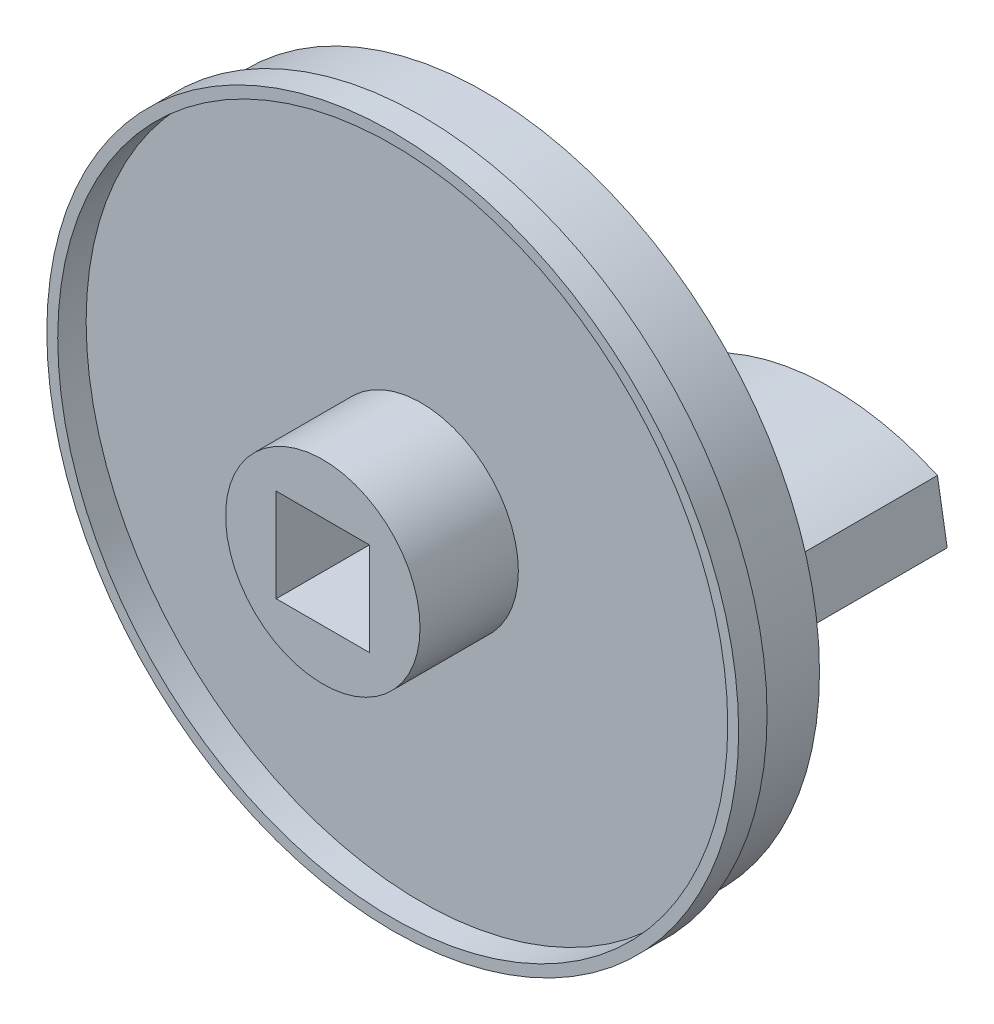
ISO-10303-21;
HEADER;
FILE_DESCRIPTION(('STEP AP214'),'2;1');
FILE_NAME('part.step','',(''),(''),'','','');
FILE_SCHEMA(('AUTOMOTIVE_DESIGN { 1 0 10303 214 1 1 1 1 }'));
ENDSEC;
DATA;
#1=APPLICATION_CONTEXT('core data for automotive mechanical design processes');
#2=APPLICATION_PROTOCOL_DEFINITION('international standard','automotive_design',2000,#1);
#3=PRODUCT_CONTEXT('',#1,'mechanical');
#4=PRODUCT('Part','Part','',(#3));
#5=PRODUCT_RELATED_PRODUCT_CATEGORY('part','',(#4));
#6=PRODUCT_DEFINITION_FORMATION('','',#4);
#7=PRODUCT_DEFINITION_CONTEXT('part definition',#1,'design');
#8=PRODUCT_DEFINITION('design','',#6,#7);
#9=PRODUCT_DEFINITION_SHAPE('','',#8);
#10=(LENGTH_UNIT() NAMED_UNIT(*) SI_UNIT(.MILLI.,.METRE.));
#11=(NAMED_UNIT(*) PLANE_ANGLE_UNIT() SI_UNIT($,.RADIAN.));
#12=(NAMED_UNIT(*) SI_UNIT($,.STERADIAN.) SOLID_ANGLE_UNIT());
#13=UNCERTAINTY_MEASURE_WITH_UNIT(LENGTH_MEASURE(1.E-05),#10,'distance_accuracy_value','');
#14=(GEOMETRIC_REPRESENTATION_CONTEXT(3) GLOBAL_UNCERTAINTY_ASSIGNED_CONTEXT((#13)) GLOBAL_UNIT_ASSIGNED_CONTEXT((#10,
#11,#12)) REPRESENTATION_CONTEXT('',''));
#15=CARTESIAN_POINT('',(0.,0.,0.));
#16=DIRECTION('',(0.,0.,1.));
#17=DIRECTION('',(1.,0.,0.));
#18=AXIS2_PLACEMENT_3D('',#15,#16,#17);
#19=CARTESIAN_POINT('',(0.,0.,-5.8166));
#20=DIRECTION('',(0.,0.,-1.));
#21=DIRECTION('',(-1.,0.,0.));
#22=AXIS2_PLACEMENT_3D('',#19,#20,#21);
#23=PLANE('',#22);
#24=CARTESIAN_POINT('',(6.89284040040389,-2.99914376690081,-5.8166));
#25=DIRECTION('',(0.,0.,-1.));
#26=DIRECTION('',(-1.,0.,0.));
#27=AXIS2_PLACEMENT_3D('',#24,#25,#26);
#28=CIRCLE('',#27,6.05951803560859);
#29=CARTESIAN_POINT('',(2.6465406178234,1.32366746889502,-5.8166));
#30=VERTEX_POINT('',#29);
#31=CARTESIAN_POINT('',(11.3117017932094,1.1471103033461,-5.8166));
#32=VERTEX_POINT('',#31);
#33=EDGE_CURVE('E65',#30,#32,#28,.T.);
#34=ORIENTED_EDGE('',*,*,#33,.F.);
#35=CARTESIAN_POINT('',(0.,0.,-5.8166));
#36=DIRECTION('',(0.,0.,-1.));
#37=DIRECTION('',(-1.,0.,0.));
#38=AXIS2_PLACEMENT_3D('',#35,#36,#37);
#39=CIRCLE('',#38,2.9591);
#40=CARTESIAN_POINT('',(1.95375325908428,2.22241333073251,-5.8166));
#41=VERTEX_POINT('',#40);
#42=EDGE_CURVE('E91',#41,#30,#39,.T.);
#43=ORIENTED_EDGE('',*,*,#42,.F.);
#44=CARTESIAN_POINT('',(7.268109870577,-5.01812678376207,-5.8166));
#45=DIRECTION('',(0.,0.,-1.));
#46=DIRECTION('',(-1.,0.,0.));
#47=AXIS2_PLACEMENT_3D('',#44,#45,#46);
#48=CIRCLE('',#47,8.98152589172471);
#49=CARTESIAN_POINT('',(10.9716639419307,3.16426251180931,-5.8166));
#50=VERTEX_POINT('',#49);
#51=EDGE_CURVE('E95',#41,#50,#48,.T.);
#52=ORIENTED_EDGE('',*,*,#51,.T.);
#53=DIRECTION('',(-0.16622792512151,0.986087357646267,0.));
#54=VECTOR('',#53,1.);
#55=CARTESIAN_POINT('',(11.1871688599829,1.88585712326514,-5.8166));
#56=LINE('',#55,#54);
#57=EDGE_CURVE('E98',#32,#50,#56,.T.);
#58=ORIENTED_EDGE('',*,*,#57,.F.);
#59=EDGE_LOOP('',(#34,#43,#52,#58));
#60=FACE_BOUND('',#59,.T.);
#61=ADVANCED_FACE('F57',(#60),#23,.T.);
#62=CARTESIAN_POINT('',(0.,0.,0.));
#63=DIRECTION('',(0.,0.,-1.));
#64=DIRECTION('',(-1.,0.,0.));
#65=AXIS2_PLACEMENT_3D('',#62,#63,#64);
#66=PLANE('',#65);
#67=CARTESIAN_POINT('',(6.89284040040389,-2.99914376690081,0.));
#68=DIRECTION('',(0.,0.,-1.));
#69=DIRECTION('',(-1.,0.,0.));
#70=AXIS2_PLACEMENT_3D('',#67,#68,#69);
#71=CIRCLE('',#70,6.05951803560859);
#72=CARTESIAN_POINT('',(2.6465406178234,1.32366746889502,0.));
#73=VERTEX_POINT('',#72);
#74=CARTESIAN_POINT('',(11.3117017932094,1.1471103033461,0.));
#75=VERTEX_POINT('',#74);
#76=EDGE_CURVE('E114',#73,#75,#71,.T.);
#77=ORIENTED_EDGE('',*,*,#76,.T.);
#78=DIRECTION('',(-0.16622792512151,0.986087357646268,0.));
#79=VECTOR('',#78,1.);
#80=CARTESIAN_POINT('',(11.1871688599829,1.88585712326514,0.));
#81=LINE('',#80,#79);
#82=CARTESIAN_POINT('',(10.9716639419307,3.16426251180931,0.));
#83=VERTEX_POINT('',#82);
#84=EDGE_CURVE('E110',#75,#83,#81,.T.);
#85=ORIENTED_EDGE('',*,*,#84,.T.);
#86=CARTESIAN_POINT('',(7.268109870577,-5.01812678376207,0.));
#87=DIRECTION('',(0.,0.,-1.));
#88=DIRECTION('',(-1.,0.,0.));
#89=AXIS2_PLACEMENT_3D('',#86,#87,#88);
#90=CIRCLE('',#89,8.98152589172471);
#91=CARTESIAN_POINT('',(1.95375325908428,2.22241333073251,0.));
#92=VERTEX_POINT('',#91);
#93=EDGE_CURVE('E120',#92,#83,#90,.T.);
#94=ORIENTED_EDGE('',*,*,#93,.F.);
#95=CARTESIAN_POINT('',(0.,0.,0.));
#96=DIRECTION('',(0.,0.,-1.));
#97=DIRECTION('',(-1.,0.,0.));
#98=AXIS2_PLACEMENT_3D('',#95,#96,#97);
#99=CIRCLE('',#98,2.9591);
#100=EDGE_CURVE('E102',#92,#73,#99,.T.);
#101=ORIENTED_EDGE('',*,*,#100,.T.);
#102=EDGE_LOOP('',(#77,#85,#94,#101));
#103=FACE_BOUND('',#102,.T.);
#104=ADVANCED_FACE('F130',(#103),#66,.F.);
#105=CARTESIAN_POINT('',(11.1871688599829,1.88585712326514,-15.5891474364846));
#106=DIRECTION('',(0.986087357646267,0.16622792512151,0.));
#107=DIRECTION('',(-0.16622792512151,0.986087357646267,0.));
#108=AXIS2_PLACEMENT_3D('',#105,#106,#107);
#109=PLANE('',#108);
#110=DIRECTION('',(0.,0.,1.));
#111=VECTOR('',#110,1.);
#112=CARTESIAN_POINT('',(11.3117017932094,1.1471103033461,-15.5891474364846));
#113=LINE('',#112,#111);
#114=EDGE_CURVE('E13',#32,#75,#113,.T.);
#115=ORIENTED_EDGE('',*,*,#114,.F.);
#116=ORIENTED_EDGE('',*,*,#57,.T.);
#117=DIRECTION('',(0.,0.,1.));
#118=VECTOR('',#117,1.);
#119=CARTESIAN_POINT('',(10.9716639419307,3.16426251180931,-15.5891474364846));
#120=LINE('',#119,#118);
#121=EDGE_CURVE('E101',#50,#83,#120,.T.);
#122=ORIENTED_EDGE('',*,*,#121,.T.);
#123=ORIENTED_EDGE('',*,*,#84,.F.);
#124=EDGE_LOOP('',(#115,#116,#122,#123));
#125=FACE_BOUND('',#124,.T.);
#126=ADVANCED_FACE('F108',(#125),#109,.T.);
#127=CARTESIAN_POINT('',(7.268109870577,-5.01812678376207,-15.5891474364846));
#128=DIRECTION('',(0.,0.,1.));
#129=DIRECTION('',(1.,0.,0.));
#130=AXIS2_PLACEMENT_3D('',#127,#128,#129);
#131=CYLINDRICAL_SURFACE('',#130,8.98152589172471);
#132=ORIENTED_EDGE('',*,*,#51,.F.);
#133=DIRECTION('',(0.,0.,1.));
#134=VECTOR('',#133,1.);
#135=CARTESIAN_POINT('',(1.95375325908428,2.22241333073251,-15.5891474364846));
#136=LINE('',#135,#134);
#137=EDGE_CURVE('E121',#41,#92,#136,.T.);
#138=ORIENTED_EDGE('',*,*,#137,.T.);
#139=ORIENTED_EDGE('',*,*,#93,.T.);
#140=ORIENTED_EDGE('',*,*,#121,.F.);
#141=EDGE_LOOP('',(#132,#138,#139,#140));
#142=FACE_BOUND('',#141,.T.);
#143=ADVANCED_FACE('F127',(#142),#131,.T.);
#144=CARTESIAN_POINT('',(0.,0.,-15.5891474364846));
#145=DIRECTION('',(0.,0.,1.));
#146=DIRECTION('',(1.,0.,0.));
#147=AXIS2_PLACEMENT_3D('',#144,#145,#146);
#148=CYLINDRICAL_SURFACE('',#147,2.9591);
#149=ORIENTED_EDGE('',*,*,#137,.F.);
#150=ORIENTED_EDGE('',*,*,#42,.T.);
#151=DIRECTION('',(0.,0.,1.));
#152=VECTOR('',#151,1.);
#153=CARTESIAN_POINT('',(2.6465406178234,1.32366746889502,-15.5891474364846));
#154=LINE('',#153,#152);
#155=EDGE_CURVE('E105',#30,#73,#154,.T.);
#156=ORIENTED_EDGE('',*,*,#155,.T.);
#157=ORIENTED_EDGE('',*,*,#100,.F.);
#158=EDGE_LOOP('',(#149,#150,#156,#157));
#159=FACE_BOUND('',#158,.T.);
#160=ADVANCED_FACE('F131',(#159),#148,.F.);
#161=CARTESIAN_POINT('',(6.89284040040389,-2.99914376690081,-15.5891474364846));
#162=DIRECTION('',(0.,0.,1.));
#163=DIRECTION('',(1.,0.,0.));
#164=AXIS2_PLACEMENT_3D('',#161,#162,#163);
#165=CYLINDRICAL_SURFACE('',#164,6.05951803560859);
#166=ORIENTED_EDGE('',*,*,#155,.F.);
#167=ORIENTED_EDGE('',*,*,#33,.T.);
#168=ORIENTED_EDGE('',*,*,#114,.T.);
#169=ORIENTED_EDGE('',*,*,#76,.F.);
#170=EDGE_LOOP('',(#166,#167,#168,#169));
#171=FACE_BOUND('',#170,.T.);
#172=ADVANCED_FACE('F104',(#171),#165,.F.);
#173=CLOSED_SHELL('',(#61,#104,#126,#143,#160,#172));
#174=MANIFOLD_SOLID_BREP('B2',#173);
#175=CARTESIAN_POINT('',(0.,0.,-5.8166));
#176=DIRECTION('',(0.,0.,-1.));
#177=DIRECTION('',(-1.,0.,0.));
#178=AXIS2_PLACEMENT_3D('',#175,#176,#177);
#179=PLANE('',#178);
#180=CARTESIAN_POINT('',(-6.93978115667021,5.34283059569983,-5.8166));
#181=DIRECTION('',(0.,0.,-1.));
#182=DIRECTION('',(-1.,0.,0.));
#183=AXIS2_PLACEMENT_3D('',#180,#181,#182);
#184=CIRCLE('',#183,6.05951803560859);
#185=CARTESIAN_POINT('',(-2.8187839026646,0.900405530902014,-5.8166));
#186=VERTEX_POINT('',#185);
#187=CARTESIAN_POINT('',(-11.3117017932094,1.1471103033461,-5.8166));
#188=VERTEX_POINT('',#187);
#189=EDGE_CURVE('E226',#186,#188,#184,.T.);
#190=ORIENTED_EDGE('',*,*,#189,.F.);
#191=CARTESIAN_POINT('',(0.,0.,-5.8166));
#192=DIRECTION('',(0.,0.,-1.));
#193=DIRECTION('',(-1.,0.,0.));
#194=AXIS2_PLACEMENT_3D('',#191,#192,#193);
#195=CIRCLE('',#194,2.9591);
#196=CARTESIAN_POINT('',(-2.8187839026646,-0.900405530902013,-5.8166));
#197=VERTEX_POINT('',#196);
#198=EDGE_CURVE('E252',#197,#186,#195,.T.);
#199=ORIENTED_EDGE('',*,*,#198,.F.);
#200=CARTESIAN_POINT('',(-6.86282923836061,7.11916457394505,-5.8166));
#201=DIRECTION('',(0.,0.,-1.));
#202=DIRECTION('',(-1.,0.,0.));
#203=AXIS2_PLACEMENT_3D('',#200,#201,#202);
#204=CIRCLE('',#203,8.98152589172471);
#205=CARTESIAN_POINT('',(-10.9678064273725,-0.869387836937235,-5.8166));
#206=VERTEX_POINT('',#205);
#207=EDGE_CURVE('E256',#197,#206,#204,.T.);
#208=ORIENTED_EDGE('',*,*,#207,.T.);
#209=DIRECTION('',(0.16811367589518,-0.985767615605732,0.));
#210=VECTOR('',#209,1.);
#211=CARTESIAN_POINT('',(-10.8019078374516,-1.84216686010636,-5.8166));
#212=LINE('',#211,#210);
#213=EDGE_CURVE('E259',#188,#206,#212,.T.);
#214=ORIENTED_EDGE('',*,*,#213,.F.);
#215=EDGE_LOOP('',(#190,#199,#208,#214));
#216=FACE_BOUND('',#215,.T.);
#217=ADVANCED_FACE('F218',(#216),#179,.T.);
#218=CARTESIAN_POINT('',(0.,0.,0.));
#219=DIRECTION('',(0.,0.,-1.));
#220=DIRECTION('',(-1.,0.,0.));
#221=AXIS2_PLACEMENT_3D('',#218,#219,#220);
#222=PLANE('',#221);
#223=CARTESIAN_POINT('',(-6.93978115667021,5.34283059569983,0.));
#224=DIRECTION('',(0.,0.,-1.));
#225=DIRECTION('',(-1.,0.,0.));
#226=AXIS2_PLACEMENT_3D('',#223,#224,#225);
#227=CIRCLE('',#226,6.05951803560859);
#228=CARTESIAN_POINT('',(-2.8187839026646,0.900405530902014,0.));
#229=VERTEX_POINT('',#228);
#230=CARTESIAN_POINT('',(-11.3117017932094,1.1471103033461,0.));
#231=VERTEX_POINT('',#230);
#232=EDGE_CURVE('E275',#229,#231,#227,.T.);
#233=ORIENTED_EDGE('',*,*,#232,.T.);
#234=DIRECTION('',(0.16811367589518,-0.985767615605732,0.));
#235=VECTOR('',#234,1.);
#236=CARTESIAN_POINT('',(-10.8019078374516,-1.84216686010636,0.));
#237=LINE('',#236,#235);
#238=CARTESIAN_POINT('',(-10.9678064273725,-0.869387836937235,0.));
#239=VERTEX_POINT('',#238);
#240=EDGE_CURVE('E271',#231,#239,#237,.T.);
#241=ORIENTED_EDGE('',*,*,#240,.T.);
#242=CARTESIAN_POINT('',(-6.86282923836061,7.11916457394505,0.));
#243=DIRECTION('',(0.,0.,-1.));
#244=DIRECTION('',(-1.,0.,0.));
#245=AXIS2_PLACEMENT_3D('',#242,#243,#244);
#246=CIRCLE('',#245,8.98152589172471);
#247=CARTESIAN_POINT('',(-2.8187839026646,-0.900405530902012,0.));
#248=VERTEX_POINT('',#247);
#249=EDGE_CURVE('E281',#248,#239,#246,.T.);
#250=ORIENTED_EDGE('',*,*,#249,.F.);
#251=CARTESIAN_POINT('',(0.,0.,0.));
#252=DIRECTION('',(0.,0.,-1.));
#253=DIRECTION('',(-1.,0.,0.));
#254=AXIS2_PLACEMENT_3D('',#251,#252,#253);
#255=CIRCLE('',#254,2.9591);
#256=EDGE_CURVE('E263',#248,#229,#255,.T.);
#257=ORIENTED_EDGE('',*,*,#256,.T.);
#258=EDGE_LOOP('',(#233,#241,#250,#257));
#259=FACE_BOUND('',#258,.T.);
#260=ADVANCED_FACE('F291',(#259),#222,.F.);
#261=CARTESIAN_POINT('',(-10.8019078374516,-1.84216686010636,-15.5891474364846));
#262=DIRECTION('',(-0.985767615605732,-0.16811367589518,0.));
#263=DIRECTION('',(0.16811367589518,-0.985767615605732,0.));
#264=AXIS2_PLACEMENT_3D('',#261,#262,#263);
#265=PLANE('',#264);
#266=DIRECTION('',(0.,0.,1.));
#267=VECTOR('',#266,1.);
#268=CARTESIAN_POINT('',(-11.3117017932094,1.1471103033461,-15.5891474364846));
#269=LINE('',#268,#267);
#270=EDGE_CURVE('E55',#188,#231,#269,.T.);
#271=ORIENTED_EDGE('',*,*,#270,.F.);
#272=ORIENTED_EDGE('',*,*,#213,.T.);
#273=DIRECTION('',(0.,0.,1.));
#274=VECTOR('',#273,1.);
#275=CARTESIAN_POINT('',(-10.9678064273725,-0.869387836937235,-15.5891474364846));
#276=LINE('',#275,#274);
#277=EDGE_CURVE('E262',#206,#239,#276,.T.);
#278=ORIENTED_EDGE('',*,*,#277,.T.);
#279=ORIENTED_EDGE('',*,*,#240,.F.);
#280=EDGE_LOOP('',(#271,#272,#278,#279));
#281=FACE_BOUND('',#280,.T.);
#282=ADVANCED_FACE('F269',(#281),#265,.T.);
#283=CARTESIAN_POINT('',(-6.86282923836061,7.11916457394505,-15.5891474364846));
#284=DIRECTION('',(0.,0.,1.));
#285=DIRECTION('',(1.,0.,0.));
#286=AXIS2_PLACEMENT_3D('',#283,#284,#285);
#287=CYLINDRICAL_SURFACE('',#286,8.98152589172471);
#288=ORIENTED_EDGE('',*,*,#207,.F.);
#289=DIRECTION('',(0.,0.,1.));
#290=VECTOR('',#289,1.);
#291=CARTESIAN_POINT('',(-2.8187839026646,-0.900405530902012,-15.5891474364846));
#292=LINE('',#291,#290);
#293=EDGE_CURVE('E282',#197,#248,#292,.T.);
#294=ORIENTED_EDGE('',*,*,#293,.T.);
#295=ORIENTED_EDGE('',*,*,#249,.T.);
#296=ORIENTED_EDGE('',*,*,#277,.F.);
#297=EDGE_LOOP('',(#288,#294,#295,#296));
#298=FACE_BOUND('',#297,.T.);
#299=ADVANCED_FACE('F288',(#298),#287,.T.);
#300=CARTESIAN_POINT('',(0.,0.,-15.5891474364846));
#301=DIRECTION('',(0.,0.,1.));
#302=DIRECTION('',(1.,0.,0.));
#303=AXIS2_PLACEMENT_3D('',#300,#301,#302);
#304=CYLINDRICAL_SURFACE('',#303,2.9591);
#305=ORIENTED_EDGE('',*,*,#293,.F.);
#306=ORIENTED_EDGE('',*,*,#198,.T.);
#307=DIRECTION('',(0.,0.,1.));
#308=VECTOR('',#307,1.);
#309=CARTESIAN_POINT('',(-2.8187839026646,0.900405530902014,-15.5891474364846));
#310=LINE('',#309,#308);
#311=EDGE_CURVE('E266',#186,#229,#310,.T.);
#312=ORIENTED_EDGE('',*,*,#311,.T.);
#313=ORIENTED_EDGE('',*,*,#256,.F.);
#314=EDGE_LOOP('',(#305,#306,#312,#313));
#315=FACE_BOUND('',#314,.T.);
#316=ADVANCED_FACE('F292',(#315),#304,.F.);
#317=CARTESIAN_POINT('',(-6.93978115667021,5.34283059569983,-15.5891474364846));
#318=DIRECTION('',(0.,0.,1.));
#319=DIRECTION('',(1.,0.,0.));
#320=AXIS2_PLACEMENT_3D('',#317,#318,#319);
#321=CYLINDRICAL_SURFACE('',#320,6.05951803560859);
#322=ORIENTED_EDGE('',*,*,#311,.F.);
#323=ORIENTED_EDGE('',*,*,#189,.T.);
#324=ORIENTED_EDGE('',*,*,#270,.T.);
#325=ORIENTED_EDGE('',*,*,#232,.F.);
#326=EDGE_LOOP('',(#322,#323,#324,#325));
#327=FACE_BOUND('',#326,.T.);
#328=ADVANCED_FACE('F265',(#327),#321,.F.);
#329=CLOSED_SHELL('',(#217,#260,#282,#299,#316,#328));
#330=MANIFOLD_SOLID_BREP('B7',#329);
#331=CARTESIAN_POINT('',(0.,0.,2.2098));
#332=DIRECTION('',(0.,0.,1.));
#333=DIRECTION('',(1.,0.,0.));
#334=AXIS2_PLACEMENT_3D('',#331,#332,#333);
#335=PLANE('',#334);
#336=CARTESIAN_POINT('',(0.,0.,2.2098));
#337=DIRECTION('',(0.,0.,1.));
#338=DIRECTION('',(1.,0.,0.));
#339=AXIS2_PLACEMENT_3D('',#336,#337,#338);
#340=CIRCLE('',#339,12.065);
#341=CARTESIAN_POINT('',(12.065,0.,2.2098));
#342=VERTEX_POINT('',#341);
#343=EDGE_CURVE('E217',#342,#342,#340,.T.);
#344=ORIENTED_EDGE('',*,*,#343,.T.);
#345=EDGE_LOOP('',(#344));
#346=FACE_BOUND('',#345,.T.);
#347=CARTESIAN_POINT('',(0.,0.,2.2098));
#348=DIRECTION('',(0.,0.,1.));
#349=DIRECTION('',(1.,0.,0.));
#350=AXIS2_PLACEMENT_3D('',#347,#348,#349);
#351=CIRCLE('',#350,11.684);
#352=CARTESIAN_POINT('',(11.684,0.,2.2098));
#353=VERTEX_POINT('',#352);
#354=EDGE_CURVE('E391',#353,#353,#351,.T.);
#355=ORIENTED_EDGE('',*,*,#354,.F.);
#356=EDGE_LOOP('',(#355));
#357=FACE_BOUND('',#356,.T.);
#358=ADVANCED_FACE('F380',(#346,#357),#335,.T.);
#359=CARTESIAN_POINT('',(0.,0.,1.2192));
#360=DIRECTION('',(0.,0.,1.));
#361=DIRECTION('',(1.,0.,0.));
#362=AXIS2_PLACEMENT_3D('',#359,#360,#361);
#363=PLANE('',#362);
#364=CARTESIAN_POINT('',(0.,0.,1.2192));
#365=DIRECTION('',(0.,0.,1.));
#366=DIRECTION('',(1.,0.,0.));
#367=AXIS2_PLACEMENT_3D('',#364,#365,#366);
#368=CIRCLE('',#367,12.065);
#369=CARTESIAN_POINT('',(12.065,0.,1.2192));
#370=VERTEX_POINT('',#369);
#371=EDGE_CURVE('E384',#370,#370,#368,.T.);
#372=ORIENTED_EDGE('',*,*,#371,.F.);
#373=EDGE_LOOP('',(#372));
#374=FACE_BOUND('',#373,.T.);
#375=CARTESIAN_POINT('',(0.,0.,1.2192));
#376=DIRECTION('',(0.,0.,1.));
#377=DIRECTION('',(1.,0.,0.));
#378=AXIS2_PLACEMENT_3D('',#375,#376,#377);
#379=CIRCLE('',#378,11.684);
#380=CARTESIAN_POINT('',(11.684,0.,1.2192));
#381=VERTEX_POINT('',#380);
#382=EDGE_CURVE('E393',#381,#381,#379,.T.);
#383=ORIENTED_EDGE('',*,*,#382,.T.);
#384=EDGE_LOOP('',(#383));
#385=FACE_BOUND('',#384,.T.);
#386=ADVANCED_FACE('F403',(#374,#385),#363,.F.);
#387=CARTESIAN_POINT('',(0.,0.,2.2098));
#388=DIRECTION('',(0.,0.,-1.));
#389=DIRECTION('',(-1.,0.,0.));
#390=AXIS2_PLACEMENT_3D('',#387,#388,#389);
#391=CYLINDRICAL_SURFACE('',#390,12.065);
#392=ORIENTED_EDGE('',*,*,#343,.F.);
#393=EDGE_LOOP('',(#392));
#394=FACE_BOUND('',#393,.T.);
#395=ORIENTED_EDGE('',*,*,#371,.T.);
#396=EDGE_LOOP('',(#395));
#397=FACE_BOUND('',#396,.T.);
#398=ADVANCED_FACE('F382',(#394,#397),#391,.T.);
#399=CARTESIAN_POINT('',(0.,0.,2.2098));
#400=DIRECTION('',(0.,0.,-1.));
#401=DIRECTION('',(-1.,0.,0.));
#402=AXIS2_PLACEMENT_3D('',#399,#400,#401);
#403=CYLINDRICAL_SURFACE('',#402,11.684);
#404=ORIENTED_EDGE('',*,*,#354,.T.);
#405=EDGE_LOOP('',(#404));
#406=FACE_BOUND('',#405,.T.);
#407=ORIENTED_EDGE('',*,*,#382,.F.);
#408=EDGE_LOOP('',(#407));
#409=FACE_BOUND('',#408,.T.);
#410=ADVANCED_FACE('F399',(#406,#409),#403,.F.);
#411=CLOSED_SHELL('',(#358,#386,#398,#410));
#412=MANIFOLD_SOLID_BREP('B49',#411);
#413=CARTESIAN_POINT('',(0.,0.,1.2192));
#414=DIRECTION('',(0.,0.,1.));
#415=DIRECTION('',(1.,0.,0.));
#416=AXIS2_PLACEMENT_3D('',#413,#414,#415);
#417=PLANE('',#416);
#418=CARTESIAN_POINT('',(0.,0.,1.2192));
#419=DIRECTION('',(0.,0.,1.));
#420=DIRECTION('',(1.,0.,0.));
#421=AXIS2_PLACEMENT_3D('',#418,#419,#420);
#422=CIRCLE('',#421,11.684);
#423=CARTESIAN_POINT('',(11.684,0.,1.2192));
#424=VERTEX_POINT('',#423);
#425=EDGE_CURVE('E540',#424,#424,#422,.T.);
#426=ORIENTED_EDGE('',*,*,#425,.T.);
#427=EDGE_LOOP('',(#426));
#428=FACE_BOUND('',#427,.T.);
#429=CARTESIAN_POINT('',(0.,0.,1.2192));
#430=DIRECTION('',(0.,0.,1.));
#431=DIRECTION('',(1.,0.,0.));
#432=AXIS2_PLACEMENT_3D('',#429,#430,#431);
#433=CIRCLE('',#432,3.3909);
#434=CARTESIAN_POINT('',(3.3909,0.,1.2192));
#435=VERTEX_POINT('',#434);
#436=EDGE_CURVE('E513',#435,#435,#433,.T.);
#437=ORIENTED_EDGE('',*,*,#436,.F.);
#438=EDGE_LOOP('',(#437));
#439=FACE_BOUND('',#438,.T.);
#440=ADVANCED_FACE('F457',(#428,#439),#417,.T.);
#441=CARTESIAN_POINT('',(0.,0.,1.2192));
#442=DIRECTION('',(0.,0.,-1.));
#443=DIRECTION('',(-1.,0.,0.));
#444=AXIS2_PLACEMENT_3D('',#441,#442,#443);
#445=CYLINDRICAL_SURFACE('',#444,11.684);
#446=ORIENTED_EDGE('',*,*,#425,.F.);
#447=EDGE_LOOP('',(#446));
#448=FACE_BOUND('',#447,.T.);
#449=CARTESIAN_POINT('',(0.,0.,-0.9906));
#450=DIRECTION('',(0.,0.,-1.));
#451=DIRECTION('',(-1.,0.,0.));
#452=AXIS2_PLACEMENT_3D('',#449,#450,#451);
#453=CIRCLE('',#452,11.684);
#454=CARTESIAN_POINT('',(-11.684,0.,-0.9906));
#455=VERTEX_POINT('',#454);
#456=EDGE_CURVE('E527',#455,#455,#453,.T.);
#457=ORIENTED_EDGE('',*,*,#456,.F.);
#458=EDGE_LOOP('',(#457));
#459=FACE_BOUND('',#458,.T.);
#460=ADVANCED_FACE('F459',(#448,#459),#445,.T.);
#461=CARTESIAN_POINT('',(0.,0.,4.6482));
#462=DIRECTION('',(0.,0.,1.));
#463=DIRECTION('',(1.,0.,0.));
#464=AXIS2_PLACEMENT_3D('',#461,#462,#463);
#465=PLANE('',#464);
#466=CARTESIAN_POINT('',(0.,0.,4.6482));
#467=DIRECTION('',(0.,0.,1.));
#468=DIRECTION('',(1.,0.,0.));
#469=AXIS2_PLACEMENT_3D('',#466,#467,#468);
#470=CIRCLE('',#469,3.3909);
#471=CARTESIAN_POINT('',(3.3909,0.,4.6482));
#472=VERTEX_POINT('',#471);
#473=EDGE_CURVE('E537',#472,#472,#470,.T.);
#474=ORIENTED_EDGE('',*,*,#473,.T.);
#475=EDGE_LOOP('',(#474));
#476=FACE_BOUND('',#475,.T.);
#477=DIRECTION('',(-1.,0.,0.));
#478=VECTOR('',#477,1.);
#479=CARTESIAN_POINT('',(-1.6256,1.6256,4.6482));
#480=LINE('',#479,#478);
#481=CARTESIAN_POINT('',(1.6256,1.6256,4.6482));
#482=VERTEX_POINT('',#481);
#483=CARTESIAN_POINT('',(-1.6256,1.6256,4.6482));
#484=VERTEX_POINT('',#483);
#485=EDGE_CURVE('E507',#482,#484,#480,.T.);
#486=ORIENTED_EDGE('',*,*,#485,.F.);
#487=DIRECTION('',(0.,1.,0.));
#488=VECTOR('',#487,1.);
#489=CARTESIAN_POINT('',(1.6256,-1.6256,4.6482));
#490=LINE('',#489,#488);
#491=CARTESIAN_POINT('',(1.6256,-1.6256,4.6482));
#492=VERTEX_POINT('',#491);
#493=EDGE_CURVE('E498',#492,#482,#490,.T.);
#494=ORIENTED_EDGE('',*,*,#493,.F.);
#495=DIRECTION('',(1.,0.,0.));
#496=VECTOR('',#495,1.);
#497=CARTESIAN_POINT('',(-1.6256,-1.6256,4.6482));
#498=LINE('',#497,#496);
#499=CARTESIAN_POINT('',(-1.6256,-1.6256,4.6482));
#500=VERTEX_POINT('',#499);
#501=EDGE_CURVE('E521',#500,#492,#498,.T.);
#502=ORIENTED_EDGE('',*,*,#501,.F.);
#503=DIRECTION('',(0.,-1.,0.));
#504=VECTOR('',#503,1.);
#505=CARTESIAN_POINT('',(-1.6256,-1.6256,4.6482));
#506=LINE('',#505,#504);
#507=EDGE_CURVE('E519',#484,#500,#506,.T.);
#508=ORIENTED_EDGE('',*,*,#507,.F.);
#509=EDGE_LOOP('',(#486,#494,#502,#508));
#510=FACE_BOUND('',#509,.T.);
#511=ADVANCED_FACE('F517',(#476,#510),#465,.T.);
#512=CARTESIAN_POINT('',(0.,0.,4.6482));
#513=DIRECTION('',(0.,0.,-1.));
#514=DIRECTION('',(-1.,0.,0.));
#515=AXIS2_PLACEMENT_3D('',#512,#513,#514);
#516=CYLINDRICAL_SURFACE('',#515,3.3909);
#517=ORIENTED_EDGE('',*,*,#473,.F.);
#518=EDGE_LOOP('',(#517));
#519=FACE_BOUND('',#518,.T.);
#520=ORIENTED_EDGE('',*,*,#436,.T.);
#521=EDGE_LOOP('',(#520));
#522=FACE_BOUND('',#521,.T.);
#523=ADVANCED_FACE('F622',(#519,#522),#516,.T.);
#524=CARTESIAN_POINT('',(1.6256,-1.6256,4.6482));
#525=DIRECTION('',(-1.,0.,0.));
#526=DIRECTION('',(0.,0.,1.));
#527=AXIS2_PLACEMENT_3D('',#524,#525,#526);
#528=PLANE('',#527);
#529=DIRECTION('',(0.,1.,0.));
#530=VECTOR('',#529,1.);
#531=CARTESIAN_POINT('',(1.6256,-1.6256,1.2192));
#532=LINE('',#531,#530);
#533=CARTESIAN_POINT('',(1.6256,-1.6256,1.2192));
#534=VERTEX_POINT('',#533);
#535=CARTESIAN_POINT('',(1.6256,1.6256,1.2192));
#536=VERTEX_POINT('',#535);
#537=EDGE_CURVE('E473',#534,#536,#532,.T.);
#538=ORIENTED_EDGE('',*,*,#537,.F.);
#539=DIRECTION('',(0.,0.,-1.));
#540=VECTOR('',#539,1.);
#541=CARTESIAN_POINT('',(1.6256,-1.6256,4.6482));
#542=LINE('',#541,#540);
#543=EDGE_CURVE('E503',#492,#534,#542,.T.);
#544=ORIENTED_EDGE('',*,*,#543,.F.);
#545=ORIENTED_EDGE('',*,*,#493,.T.);
#546=DIRECTION('',(0.,0.,-1.));
#547=VECTOR('',#546,1.);
#548=CARTESIAN_POINT('',(1.6256,1.6256,4.6482));
#549=LINE('',#548,#547);
#550=EDGE_CURVE('E501',#482,#536,#549,.T.);
#551=ORIENTED_EDGE('',*,*,#550,.T.);
#552=EDGE_LOOP('',(#538,#544,#545,#551));
#553=FACE_BOUND('',#552,.T.);
#554=ADVANCED_FACE('F500',(#553),#528,.T.);
#555=CARTESIAN_POINT('',(-1.6256,1.6256,4.6482));
#556=DIRECTION('',(0.,-1.,0.));
#557=DIRECTION('',(0.,0.,-1.));
#558=AXIS2_PLACEMENT_3D('',#555,#556,#557);
#559=PLANE('',#558);
#560=DIRECTION('',(-1.,0.,0.));
#561=VECTOR('',#560,1.);
#562=CARTESIAN_POINT('',(-1.6256,1.6256,1.2192));
#563=LINE('',#562,#561);
#564=CARTESIAN_POINT('',(-1.6256,1.6256,1.2192));
#565=VERTEX_POINT('',#564);
#566=EDGE_CURVE('E477',#536,#565,#563,.T.);
#567=ORIENTED_EDGE('',*,*,#566,.F.);
#568=ORIENTED_EDGE('',*,*,#550,.F.);
#569=ORIENTED_EDGE('',*,*,#485,.T.);
#570=DIRECTION('',(0.,0.,-1.));
#571=VECTOR('',#570,1.);
#572=CARTESIAN_POINT('',(-1.6256,1.6256,4.6482));
#573=LINE('',#572,#571);
#574=EDGE_CURVE('E514',#484,#565,#573,.T.);
#575=ORIENTED_EDGE('',*,*,#574,.T.);
#576=EDGE_LOOP('',(#567,#568,#569,#575));
#577=FACE_BOUND('',#576,.T.);
#578=ADVANCED_FACE('F511',(#577),#559,.T.);
#579=CARTESIAN_POINT('',(-1.6256,-1.6256,4.6482));
#580=DIRECTION('',(1.,0.,0.));
#581=DIRECTION('',(0.,0.,-1.));
#582=AXIS2_PLACEMENT_3D('',#579,#580,#581);
#583=PLANE('',#582);
#584=DIRECTION('',(0.,-1.,0.));
#585=VECTOR('',#584,1.);
#586=CARTESIAN_POINT('',(-1.6256,-1.6256,1.2192));
#587=LINE('',#586,#585);
#588=CARTESIAN_POINT('',(-1.6256,-1.6256,1.2192));
#589=VERTEX_POINT('',#588);
#590=EDGE_CURVE('E529',#565,#589,#587,.T.);
#591=ORIENTED_EDGE('',*,*,#590,.F.);
#592=ORIENTED_EDGE('',*,*,#574,.F.);
#593=ORIENTED_EDGE('',*,*,#507,.T.);
#594=DIRECTION('',(0.,0.,-1.));
#595=VECTOR('',#594,1.);
#596=CARTESIAN_POINT('',(-1.6256,-1.6256,4.6482));
#597=LINE('',#596,#595);
#598=EDGE_CURVE('E533',#500,#589,#597,.T.);
#599=ORIENTED_EDGE('',*,*,#598,.T.);
#600=EDGE_LOOP('',(#591,#592,#593,#599));
#601=FACE_BOUND('',#600,.T.);
#602=ADVANCED_FACE('F608',(#601),#583,.T.);
#603=CARTESIAN_POINT('',(-1.6256,-1.6256,4.6482));
#604=DIRECTION('',(0.,1.,0.));
#605=DIRECTION('',(0.,0.,1.));
#606=AXIS2_PLACEMENT_3D('',#603,#604,#605);
#607=PLANE('',#606);
#608=DIRECTION('',(1.,0.,0.));
#609=VECTOR('',#608,1.);
#610=CARTESIAN_POINT('',(-1.6256,-1.6256,1.2192));
#611=LINE('',#610,#609);
#612=EDGE_CURVE('E508',#589,#534,#611,.T.);
#613=ORIENTED_EDGE('',*,*,#612,.F.);
#614=ORIENTED_EDGE('',*,*,#598,.F.);
#615=ORIENTED_EDGE('',*,*,#501,.T.);
#616=ORIENTED_EDGE('',*,*,#543,.T.);
#617=EDGE_LOOP('',(#613,#614,#615,#616));
#618=FACE_BOUND('',#617,.T.);
#619=ADVANCED_FACE('F601',(#618),#607,.T.);
#620=ORIENTED_EDGE('',*,*,#537,.T.);
#621=ORIENTED_EDGE('',*,*,#566,.T.);
#622=ORIENTED_EDGE('',*,*,#590,.T.);
#623=ORIENTED_EDGE('',*,*,#612,.T.);
#624=EDGE_LOOP('',(#620,#621,#622,#623));
#625=FACE_BOUND('',#624,.T.);
#626=ADVANCED_FACE('F592',(#625),#417,.T.);
#627=CARTESIAN_POINT('',(0.,0.,-0.9906));
#628=DIRECTION('',(0.,0.,1.));
#629=DIRECTION('',(1.,0.,0.));
#630=AXIS2_PLACEMENT_3D('',#627,#628,#629);
#631=CYLINDRICAL_SURFACE('',#630,10.6934);
#632=CARTESIAN_POINT('',(0.,0.,-0.9906));
#633=DIRECTION('',(0.,0.,-1.));
#634=DIRECTION('',(-1.,0.,0.));
#635=AXIS2_PLACEMENT_3D('',#632,#633,#634);
#636=CIRCLE('',#635,10.6934);
#637=CARTESIAN_POINT('',(-10.6934,0.,-0.9906));
#638=VERTEX_POINT('',#637);
#639=EDGE_CURVE('E558',#638,#638,#636,.T.);
#640=ORIENTED_EDGE('',*,*,#639,.T.);
#641=EDGE_LOOP('',(#640));
#642=FACE_BOUND('',#641,.T.);
#643=CARTESIAN_POINT('',(0.,0.,0.));
#644=DIRECTION('',(0.,0.,-1.));
#645=DIRECTION('',(-1.,0.,0.));
#646=AXIS2_PLACEMENT_3D('',#643,#644,#645);
#647=CIRCLE('',#646,10.6934);
#648=CARTESIAN_POINT('',(-10.6934,0.,0.));
#649=VERTEX_POINT('',#648);
#650=EDGE_CURVE('E556',#649,#649,#647,.T.);
#651=ORIENTED_EDGE('',*,*,#650,.F.);
#652=EDGE_LOOP('',(#651));
#653=FACE_BOUND('',#652,.T.);
#654=ADVANCED_FACE('F600',(#642,#653),#631,.F.);
#655=CARTESIAN_POINT('',(0.,0.,-0.9906));
#656=DIRECTION('',(0.,0.,-1.));
#657=DIRECTION('',(-1.,0.,0.));
#658=AXIS2_PLACEMENT_3D('',#655,#656,#657);
#659=PLANE('',#658);
#660=ORIENTED_EDGE('',*,*,#639,.F.);
#661=EDGE_LOOP('',(#660));
#662=FACE_BOUND('',#661,.T.);
#663=ORIENTED_EDGE('',*,*,#456,.T.);
#664=EDGE_LOOP('',(#663));
#665=FACE_BOUND('',#664,.T.);
#666=ADVANCED_FACE('F553',(#662,#665),#659,.T.);
#667=CARTESIAN_POINT('',(0.,0.,0.));
#668=DIRECTION('',(0.,0.,1.));
#669=DIRECTION('',(1.,0.,0.));
#670=AXIS2_PLACEMENT_3D('',#667,#668,#669);
#671=PLANE('',#670);
#672=CARTESIAN_POINT('',(0.,0.,0.));
#673=DIRECTION('',(0.,0.,1.));
#674=DIRECTION('',(1.,0.,0.));
#675=AXIS2_PLACEMENT_3D('',#672,#673,#674);
#676=CIRCLE('',#675,3.81);
#677=CARTESIAN_POINT('',(3.81,0.,0.));
#678=VERTEX_POINT('',#677);
#679=EDGE_CURVE('E461',#678,#678,#676,.F.);
#680=ORIENTED_EDGE('',*,*,#679,.F.);
#681=EDGE_LOOP('',(#680));
#682=FACE_BOUND('',#681,.T.);
#683=ORIENTED_EDGE('',*,*,#650,.T.);
#684=EDGE_LOOP('',(#683));
#685=FACE_BOUND('',#684,.T.);
#686=ADVANCED_FACE('F550',(#682,#685),#671,.F.);
#687=CARTESIAN_POINT('',(0.,0.,-0.9906));
#688=DIRECTION('',(0.,0.,1.));
#689=DIRECTION('',(1.,0.,0.));
#690=AXIS2_PLACEMENT_3D('',#687,#688,#689);
#691=CYLINDRICAL_SURFACE('',#690,3.81);
#692=CARTESIAN_POINT('',(0.,0.,-0.9906));
#693=DIRECTION('',(0.,0.,-1.));
#694=DIRECTION('',(-1.,0.,0.));
#695=AXIS2_PLACEMENT_3D('',#692,#693,#694);
#696=CIRCLE('',#695,3.81);
#697=CARTESIAN_POINT('',(-3.81,0.,-0.9906));
#698=VERTEX_POINT('',#697);
#699=EDGE_CURVE('E559',#698,#698,#696,.T.);
#700=ORIENTED_EDGE('',*,*,#699,.F.);
#701=EDGE_LOOP('',(#700));
#702=FACE_BOUND('',#701,.T.);
#703=ORIENTED_EDGE('',*,*,#679,.T.);
#704=EDGE_LOOP('',(#703));
#705=FACE_BOUND('',#704,.T.);
#706=ADVANCED_FACE('F548',(#702,#705),#691,.T.);
#707=CARTESIAN_POINT('',(0.,0.,-0.9906));
#708=DIRECTION('',(0.,0.,-1.));
#709=DIRECTION('',(-1.,0.,0.));
#710=AXIS2_PLACEMENT_3D('',#707,#708,#709);
#711=PLANE('',#710);
#712=CARTESIAN_POINT('',(0.,0.,-0.9906));
#713=DIRECTION('',(0.,0.,-1.));
#714=DIRECTION('',(-1.,0.,0.));
#715=AXIS2_PLACEMENT_3D('',#712,#713,#714);
#716=CIRCLE('',#715,2.9591);
#717=CARTESIAN_POINT('',(-2.9591,0.,-0.9906));
#718=VERTEX_POINT('',#717);
#719=EDGE_CURVE('E378',#718,#718,#716,.T.);
#720=ORIENTED_EDGE('',*,*,#719,.F.);
#721=EDGE_LOOP('',(#720));
#722=FACE_BOUND('',#721,.T.);
#723=ORIENTED_EDGE('',*,*,#699,.T.);
#724=EDGE_LOOP('',(#723));
#725=FACE_BOUND('',#724,.T.);
#726=ADVANCED_FACE('F576',(#722,#725),#711,.T.);
#727=CARTESIAN_POINT('',(0.,0.,-5.8166));
#728=DIRECTION('',(0.,0.,1.));
#729=DIRECTION('',(1.,0.,0.));
#730=AXIS2_PLACEMENT_3D('',#727,#728,#729);
#731=CYLINDRICAL_SURFACE('',#730,2.9591);
#732=CARTESIAN_POINT('',(0.,0.,-5.8166));
#733=DIRECTION('',(0.,0.,-1.));
#734=DIRECTION('',(-1.,0.,0.));
#735=AXIS2_PLACEMENT_3D('',#732,#733,#734);
#736=CIRCLE('',#735,2.9591);
#737=CARTESIAN_POINT('',(-2.9591,0.,-5.8166));
#738=VERTEX_POINT('',#737);
#739=EDGE_CURVE('E563',#738,#738,#736,.T.);
#740=ORIENTED_EDGE('',*,*,#739,.F.);
#741=EDGE_LOOP('',(#740));
#742=FACE_BOUND('',#741,.T.);
#743=ORIENTED_EDGE('',*,*,#719,.T.);
#744=EDGE_LOOP('',(#743));
#745=FACE_BOUND('',#744,.T.);
#746=ADVANCED_FACE('F573',(#742,#745),#731,.T.);
#747=CARTESIAN_POINT('',(0.,0.,-5.8166));
#748=DIRECTION('',(0.,0.,-1.));
#749=DIRECTION('',(-1.,0.,0.));
#750=AXIS2_PLACEMENT_3D('',#747,#748,#749);
#751=PLANE('',#750);
#752=ORIENTED_EDGE('',*,*,#739,.T.);
#753=EDGE_LOOP('',(#752));
#754=FACE_BOUND('',#753,.T.);
#755=ADVANCED_FACE('F571',(#754),#751,.T.);
#756=CLOSED_SHELL('',(#440,#460,#511,#523,#554,#578,#602,#619,#626,#654,#666,#686,#706,#726,
#746,#755));
#757=MANIFOLD_SOLID_BREP('B212',#756);
#758=ADVANCED_BREP_SHAPE_REPRESENTATION('',(#18,#174,#330,#412,#757),#14);
#759=SHAPE_DEFINITION_REPRESENTATION(#9,#758);
ENDSEC;
END-ISO-10303-21;
